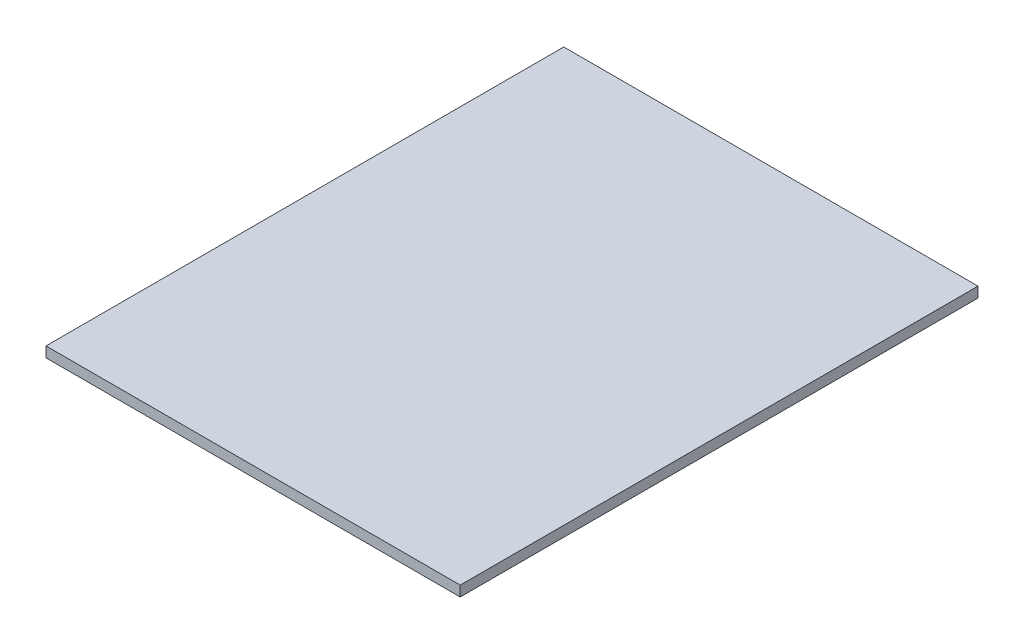
ISO-10303-21;
HEADER;
FILE_DESCRIPTION(('STEP AP214'),'2;1');
FILE_NAME('part.step','',(''),(''),'','','');
FILE_SCHEMA(('AUTOMOTIVE_DESIGN { 1 0 10303 214 1 1 1 1 }'));
ENDSEC;
DATA;
#1=APPLICATION_CONTEXT('core data for automotive mechanical design processes');
#2=APPLICATION_PROTOCOL_DEFINITION('international standard','automotive_design',2000,#1);
#3=PRODUCT_CONTEXT('',#1,'mechanical');
#4=PRODUCT('Part','Part','',(#3));
#5=PRODUCT_RELATED_PRODUCT_CATEGORY('part','',(#4));
#6=PRODUCT_DEFINITION_FORMATION('','',#4);
#7=PRODUCT_DEFINITION_CONTEXT('part definition',#1,'design');
#8=PRODUCT_DEFINITION('design','',#6,#7);
#9=PRODUCT_DEFINITION_SHAPE('','',#8);
#10=(LENGTH_UNIT() NAMED_UNIT(*) SI_UNIT(.MILLI.,.METRE.));
#11=(NAMED_UNIT(*) PLANE_ANGLE_UNIT() SI_UNIT($,.RADIAN.));
#12=(NAMED_UNIT(*) SI_UNIT($,.STERADIAN.) SOLID_ANGLE_UNIT());
#13=UNCERTAINTY_MEASURE_WITH_UNIT(LENGTH_MEASURE(1.E-05),#10,'distance_accuracy_value','');
#14=(GEOMETRIC_REPRESENTATION_CONTEXT(3) GLOBAL_UNCERTAINTY_ASSIGNED_CONTEXT((#13)) GLOBAL_UNIT_ASSIGNED_CONTEXT((#10,
#11,#12)) REPRESENTATION_CONTEXT('',''));
#15=CARTESIAN_POINT('',(0.,0.,0.));
#16=DIRECTION('',(0.,0.,1.));
#17=DIRECTION('',(1.,0.,0.));
#18=AXIS2_PLACEMENT_3D('',#15,#16,#17);
#19=CARTESIAN_POINT('',(-100.,5.,125.));
#20=DIRECTION('',(1.,0.,0.));
#21=DIRECTION('',(0.,0.,-1.));
#22=AXIS2_PLACEMENT_3D('',#19,#20,#21);
#23=PLANE('',#22);
#24=DIRECTION('',(0.,0.,1.));
#25=VECTOR('',#24,1.);
#26=CARTESIAN_POINT('',(-100.,0.,125.));
#27=LINE('',#26,#25);
#28=CARTESIAN_POINT('',(-100.,0.,-125.));
#29=VERTEX_POINT('',#28);
#30=CARTESIAN_POINT('',(-100.,0.,125.));
#31=VERTEX_POINT('',#30);
#32=EDGE_CURVE('E101',#29,#31,#27,.T.);
#33=ORIENTED_EDGE('',*,*,#32,.T.);
#34=DIRECTION('',(0.,-1.,0.));
#35=VECTOR('',#34,1.);
#36=CARTESIAN_POINT('',(-100.,5.,125.));
#37=LINE('',#36,#35);
#38=CARTESIAN_POINT('',(-100.,5.,125.));
#39=VERTEX_POINT('',#38);
#40=EDGE_CURVE('E11',#39,#31,#37,.T.);
#41=ORIENTED_EDGE('',*,*,#40,.F.);
#42=DIRECTION('',(0.,0.,1.));
#43=VECTOR('',#42,1.);
#44=CARTESIAN_POINT('',(-100.,5.,125.));
#45=LINE('',#44,#43);
#46=CARTESIAN_POINT('',(-100.,5.,-125.));
#47=VERTEX_POINT('',#46);
#48=EDGE_CURVE('E89',#47,#39,#45,.T.);
#49=ORIENTED_EDGE('',*,*,#48,.F.);
#50=DIRECTION('',(0.,-1.,0.));
#51=VECTOR('',#50,1.);
#52=CARTESIAN_POINT('',(-100.,5.,-125.));
#53=LINE('',#52,#51);
#54=EDGE_CURVE('E97',#47,#29,#53,.T.);
#55=ORIENTED_EDGE('',*,*,#54,.T.);
#56=EDGE_LOOP('',(#33,#41,#49,#55));
#57=FACE_BOUND('',#56,.T.);
#58=ADVANCED_FACE('F38',(#57),#23,.F.);
#59=CARTESIAN_POINT('',(100.,5.,125.));
#60=DIRECTION('',(0.,0.,-1.));
#61=DIRECTION('',(-1.,0.,0.));
#62=AXIS2_PLACEMENT_3D('',#59,#60,#61);
#63=PLANE('',#62);
#64=DIRECTION('',(1.,0.,0.));
#65=VECTOR('',#64,1.);
#66=CARTESIAN_POINT('',(100.,0.,125.));
#67=LINE('',#66,#65);
#68=CARTESIAN_POINT('',(100.,0.,125.));
#69=VERTEX_POINT('',#68);
#70=EDGE_CURVE('E93',#31,#69,#67,.T.);
#71=ORIENTED_EDGE('',*,*,#70,.T.);
#72=DIRECTION('',(0.,-1.,0.));
#73=VECTOR('',#72,1.);
#74=CARTESIAN_POINT('',(100.,5.,125.));
#75=LINE('',#74,#73);
#76=CARTESIAN_POINT('',(100.,5.,125.));
#77=VERTEX_POINT('',#76);
#78=EDGE_CURVE('E46',#77,#69,#75,.T.);
#79=ORIENTED_EDGE('',*,*,#78,.F.);
#80=DIRECTION('',(1.,0.,0.));
#81=VECTOR('',#80,1.);
#82=CARTESIAN_POINT('',(100.,5.,125.));
#83=LINE('',#82,#81);
#84=EDGE_CURVE('E84',#39,#77,#83,.T.);
#85=ORIENTED_EDGE('',*,*,#84,.F.);
#86=ORIENTED_EDGE('',*,*,#40,.T.);
#87=EDGE_LOOP('',(#71,#79,#85,#86));
#88=FACE_BOUND('',#87,.T.);
#89=ADVANCED_FACE('F92',(#88),#63,.F.);
#90=CARTESIAN_POINT('',(100.,5.,125.));
#91=DIRECTION('',(-1.,0.,0.));
#92=DIRECTION('',(0.,0.,1.));
#93=AXIS2_PLACEMENT_3D('',#90,#91,#92);
#94=PLANE('',#93);
#95=DIRECTION('',(0.,0.,-1.));
#96=VECTOR('',#95,1.);
#97=CARTESIAN_POINT('',(100.,0.,125.));
#98=LINE('',#97,#96);
#99=CARTESIAN_POINT('',(100.,0.,-125.));
#100=VERTEX_POINT('',#99);
#101=EDGE_CURVE('E71',#69,#100,#98,.T.);
#102=ORIENTED_EDGE('',*,*,#101,.T.);
#103=DIRECTION('',(0.,-1.,0.));
#104=VECTOR('',#103,1.);
#105=CARTESIAN_POINT('',(100.,5.,-125.));
#106=LINE('',#105,#104);
#107=CARTESIAN_POINT('',(100.,5.,-125.));
#108=VERTEX_POINT('',#107);
#109=EDGE_CURVE('E94',#108,#100,#106,.T.);
#110=ORIENTED_EDGE('',*,*,#109,.F.);
#111=DIRECTION('',(0.,0.,-1.));
#112=VECTOR('',#111,1.);
#113=CARTESIAN_POINT('',(100.,5.,125.));
#114=LINE('',#113,#112);
#115=EDGE_CURVE('E87',#77,#108,#114,.T.);
#116=ORIENTED_EDGE('',*,*,#115,.F.);
#117=ORIENTED_EDGE('',*,*,#78,.T.);
#118=EDGE_LOOP('',(#102,#110,#116,#117));
#119=FACE_BOUND('',#118,.T.);
#120=ADVANCED_FACE('F95',(#119),#94,.F.);
#121=CARTESIAN_POINT('',(100.,5.,-125.));
#122=DIRECTION('',(0.,0.,1.));
#123=DIRECTION('',(1.,0.,0.));
#124=AXIS2_PLACEMENT_3D('',#121,#122,#123);
#125=PLANE('',#124);
#126=DIRECTION('',(-1.,0.,0.));
#127=VECTOR('',#126,1.);
#128=CARTESIAN_POINT('',(100.,0.,-125.));
#129=LINE('',#128,#127);
#130=EDGE_CURVE('E77',#100,#29,#129,.T.);
#131=ORIENTED_EDGE('',*,*,#130,.T.);
#132=ORIENTED_EDGE('',*,*,#54,.F.);
#133=DIRECTION('',(-1.,0.,0.));
#134=VECTOR('',#133,1.);
#135=CARTESIAN_POINT('',(100.,5.,-125.));
#136=LINE('',#135,#134);
#137=EDGE_CURVE('E54',#108,#47,#136,.T.);
#138=ORIENTED_EDGE('',*,*,#137,.F.);
#139=ORIENTED_EDGE('',*,*,#109,.T.);
#140=EDGE_LOOP('',(#131,#132,#138,#139));
#141=FACE_BOUND('',#140,.T.);
#142=ADVANCED_FACE('F108',(#141),#125,.F.);
#143=CARTESIAN_POINT('',(0.,5.,0.));
#144=DIRECTION('',(0.,1.,0.));
#145=DIRECTION('',(0.,0.,1.));
#146=AXIS2_PLACEMENT_3D('',#143,#144,#145);
#147=PLANE('',#146);
#148=ORIENTED_EDGE('',*,*,#48,.T.);
#149=ORIENTED_EDGE('',*,*,#84,.T.);
#150=ORIENTED_EDGE('',*,*,#115,.T.);
#151=ORIENTED_EDGE('',*,*,#137,.T.);
#152=EDGE_LOOP('',(#148,#149,#150,#151));
#153=FACE_BOUND('',#152,.T.);
#154=ADVANCED_FACE('F85',(#153),#147,.T.);
#155=CARTESIAN_POINT('',(0.,0.,0.));
#156=DIRECTION('',(0.,1.,0.));
#157=DIRECTION('',(0.,0.,1.));
#158=AXIS2_PLACEMENT_3D('',#155,#156,#157);
#159=PLANE('',#158);
#160=ORIENTED_EDGE('',*,*,#32,.F.);
#161=ORIENTED_EDGE('',*,*,#130,.F.);
#162=ORIENTED_EDGE('',*,*,#101,.F.);
#163=ORIENTED_EDGE('',*,*,#70,.F.);
#164=EDGE_LOOP('',(#160,#161,#162,#163));
#165=FACE_BOUND('',#164,.T.);
#166=ADVANCED_FACE('F111',(#165),#159,.F.);
#167=CLOSED_SHELL('',(#58,#89,#120,#142,#154,#166));
#168=MANIFOLD_SOLID_BREP('B2',#167);
#169=ADVANCED_BREP_SHAPE_REPRESENTATION('',(#18,#168),#14);
#170=SHAPE_DEFINITION_REPRESENTATION(#9,#169);
ENDSEC;
END-ISO-10303-21;
